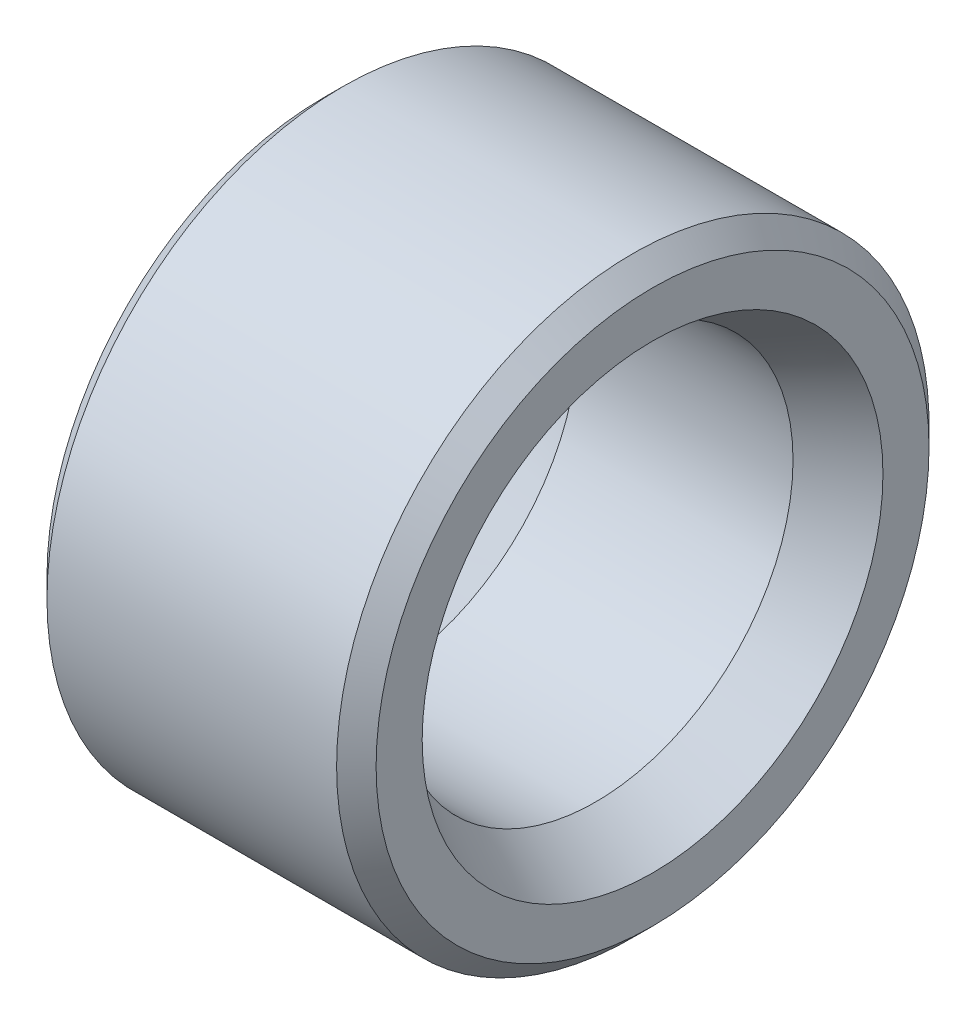
ISO-10303-21;
HEADER;
FILE_DESCRIPTION(('STEP AP214'),'2;1');
FILE_NAME('part.step','',(''),(''),'','','');
FILE_SCHEMA(('AUTOMOTIVE_DESIGN { 1 0 10303 214 1 1 1 1 }'));
ENDSEC;
DATA;
#1=APPLICATION_CONTEXT('core data for automotive mechanical design processes');
#2=APPLICATION_PROTOCOL_DEFINITION('international standard','automotive_design',2000,#1);
#3=PRODUCT_CONTEXT('',#1,'mechanical');
#4=PRODUCT('Part','Part','',(#3));
#5=PRODUCT_RELATED_PRODUCT_CATEGORY('part','',(#4));
#6=PRODUCT_DEFINITION_FORMATION('','',#4);
#7=PRODUCT_DEFINITION_CONTEXT('part definition',#1,'design');
#8=PRODUCT_DEFINITION('design','',#6,#7);
#9=PRODUCT_DEFINITION_SHAPE('','',#8);
#10=(LENGTH_UNIT() NAMED_UNIT(*) SI_UNIT(.MILLI.,.METRE.));
#11=(NAMED_UNIT(*) PLANE_ANGLE_UNIT() SI_UNIT($,.RADIAN.));
#12=(NAMED_UNIT(*) SI_UNIT($,.STERADIAN.) SOLID_ANGLE_UNIT());
#13=UNCERTAINTY_MEASURE_WITH_UNIT(LENGTH_MEASURE(1.E-05),#10,'distance_accuracy_value','');
#14=(GEOMETRIC_REPRESENTATION_CONTEXT(3) GLOBAL_UNCERTAINTY_ASSIGNED_CONTEXT((#13)) GLOBAL_UNIT_ASSIGNED_CONTEXT((#10,
#11,#12)) REPRESENTATION_CONTEXT('',''));
#15=CARTESIAN_POINT('',(0.,0.,0.));
#16=DIRECTION('',(0.,0.,1.));
#17=DIRECTION('',(1.,0.,0.));
#18=AXIS2_PLACEMENT_3D('',#15,#16,#17);
#19=CARTESIAN_POINT('',(0.,0.,0.));
#20=DIRECTION('',(-1.,0.,0.));
#21=DIRECTION('',(0.,0.,1.));
#22=AXIS2_PLACEMENT_3D('',#19,#20,#21);
#23=CYLINDRICAL_SURFACE('',#22,3.);
#24=CARTESIAN_POINT('',(0.866025403784451,0.,0.));
#25=DIRECTION('',(-1.,0.,0.));
#26=DIRECTION('',(0.,0.,1.));
#27=AXIS2_PLACEMENT_3D('',#24,#25,#26);
#28=CIRCLE('',#27,3.);
#29=CARTESIAN_POINT('',(0.866025403784451,0.,3.));
#30=VERTEX_POINT('',#29);
#31=EDGE_CURVE('E61',#30,#30,#28,.T.);
#32=ORIENTED_EDGE('',*,*,#31,.T.);
#33=EDGE_LOOP('',(#32));
#34=FACE_BOUND('',#33,.T.);
#35=CARTESIAN_POINT('',(4.13397459621555,0.,0.));
#36=DIRECTION('',(-1.,0.,0.));
#37=DIRECTION('',(0.,0.,1.));
#38=AXIS2_PLACEMENT_3D('',#35,#36,#37);
#39=CIRCLE('',#38,3.);
#40=CARTESIAN_POINT('',(4.13397459621555,0.,3.));
#41=VERTEX_POINT('',#40);
#42=EDGE_CURVE('E67',#41,#41,#39,.T.);
#43=ORIENTED_EDGE('',*,*,#42,.F.);
#44=EDGE_LOOP('',(#43));
#45=FACE_BOUND('',#44,.T.);
#46=ADVANCED_FACE('F38',(#34,#45),#23,.F.);
#47=CARTESIAN_POINT('',(5.,4.5,0.));
#48=DIRECTION('',(-1.,0.,0.));
#49=DIRECTION('',(0.,0.,1.));
#50=AXIS2_PLACEMENT_3D('',#47,#48,#49);
#51=PLANE('',#50);
#52=CARTESIAN_POINT('',(5.,0.,0.));
#53=DIRECTION('',(-1.,0.,0.));
#54=DIRECTION('',(0.,0.,1.));
#55=AXIS2_PLACEMENT_3D('',#52,#53,#54);
#56=CIRCLE('',#55,4.2);
#57=CARTESIAN_POINT('',(5.,0.,4.2));
#58=VERTEX_POINT('',#57);
#59=EDGE_CURVE('E45',#58,#58,#56,.F.);
#60=ORIENTED_EDGE('',*,*,#59,.T.);
#61=EDGE_LOOP('',(#60));
#62=FACE_BOUND('',#61,.T.);
#63=CARTESIAN_POINT('',(5.,0.,0.));
#64=DIRECTION('',(-1.,0.,0.));
#65=DIRECTION('',(0.,0.,1.));
#66=AXIS2_PLACEMENT_3D('',#63,#64,#65);
#67=CIRCLE('',#66,3.5);
#68=CARTESIAN_POINT('',(5.,0.,3.5));
#69=VERTEX_POINT('',#68);
#70=EDGE_CURVE('E64',#69,#69,#67,.T.);
#71=ORIENTED_EDGE('',*,*,#70,.T.);
#72=EDGE_LOOP('',(#71));
#73=FACE_BOUND('',#72,.T.);
#74=ADVANCED_FACE('F75',(#62,#73),#51,.F.);
#75=CARTESIAN_POINT('',(0.,3.,0.));
#76=DIRECTION('',(1.,0.,0.));
#77=DIRECTION('',(0.,0.,-1.));
#78=AXIS2_PLACEMENT_3D('',#75,#76,#77);
#79=PLANE('',#78);
#80=CARTESIAN_POINT('',(0.,0.,0.));
#81=DIRECTION('',(1.,0.,0.));
#82=DIRECTION('',(0.,0.,-1.));
#83=AXIS2_PLACEMENT_3D('',#80,#81,#82);
#84=CIRCLE('',#83,4.2);
#85=CARTESIAN_POINT('',(0.,0.,-4.2));
#86=VERTEX_POINT('',#85);
#87=EDGE_CURVE('E10',#86,#86,#84,.F.);
#88=ORIENTED_EDGE('',*,*,#87,.T.);
#89=EDGE_LOOP('',(#88));
#90=FACE_BOUND('',#89,.T.);
#91=CARTESIAN_POINT('',(0.,0.,0.));
#92=DIRECTION('',(-1.,0.,0.));
#93=DIRECTION('',(0.,0.,1.));
#94=AXIS2_PLACEMENT_3D('',#91,#92,#93);
#95=CIRCLE('',#94,3.5);
#96=CARTESIAN_POINT('',(0.,0.,3.5));
#97=VERTEX_POINT('',#96);
#98=EDGE_CURVE('E58',#97,#97,#95,.T.);
#99=ORIENTED_EDGE('',*,*,#98,.F.);
#100=EDGE_LOOP('',(#99));
#101=FACE_BOUND('',#100,.T.);
#102=ADVANCED_FACE('F81',(#90,#101),#79,.F.);
#103=CARTESIAN_POINT('',(0.,0.,0.));
#104=DIRECTION('',(-1.,0.,0.));
#105=DIRECTION('',(0.,0.,1.));
#106=AXIS2_PLACEMENT_3D('',#103,#104,#105);
#107=CYLINDRICAL_SURFACE('',#106,4.5);
#108=CARTESIAN_POINT('',(4.7,0.,0.));
#109=DIRECTION('',(-1.,0.,0.));
#110=DIRECTION('',(0.,0.,1.));
#111=AXIS2_PLACEMENT_3D('',#108,#109,#110);
#112=CIRCLE('',#111,4.5);
#113=CARTESIAN_POINT('',(4.7,0.,4.5));
#114=VERTEX_POINT('',#113);
#115=EDGE_CURVE('E49',#114,#114,#112,.T.);
#116=ORIENTED_EDGE('',*,*,#115,.T.);
#117=EDGE_LOOP('',(#116));
#118=FACE_BOUND('',#117,.T.);
#119=CARTESIAN_POINT('',(0.3,0.,0.));
#120=DIRECTION('',(1.,0.,0.));
#121=DIRECTION('',(0.,0.,-1.));
#122=AXIS2_PLACEMENT_3D('',#119,#120,#121);
#123=CIRCLE('',#122,4.5);
#124=CARTESIAN_POINT('',(0.3,0.,-4.5));
#125=VERTEX_POINT('',#124);
#126=EDGE_CURVE('E53',#125,#125,#123,.T.);
#127=ORIENTED_EDGE('',*,*,#126,.T.);
#128=EDGE_LOOP('',(#127));
#129=FACE_BOUND('',#128,.T.);
#130=ADVANCED_FACE('F87',(#118,#129),#107,.T.);
#131=CARTESIAN_POINT('',(4.7,0.,0.));
#132=DIRECTION('',(-1.,0.,0.));
#133=DIRECTION('',(0.,0.,1.));
#134=AXIS2_PLACEMENT_3D('',#131,#132,#133);
#135=CONICAL_SURFACE('',#134,4.5,0.785398163397446);
#136=ORIENTED_EDGE('',*,*,#59,.F.);
#137=EDGE_LOOP('',(#136));
#138=FACE_BOUND('',#137,.T.);
#139=ORIENTED_EDGE('',*,*,#115,.F.);
#140=EDGE_LOOP('',(#139));
#141=FACE_BOUND('',#140,.T.);
#142=ADVANCED_FACE('F85',(#138,#141),#135,.T.);
#143=CARTESIAN_POINT('',(0.,0.,0.));
#144=DIRECTION('',(1.,0.,0.));
#145=DIRECTION('',(0.,0.,-1.));
#146=AXIS2_PLACEMENT_3D('',#143,#144,#145);
#147=CONICAL_SURFACE('',#146,4.2,0.785398163397447);
#148=ORIENTED_EDGE('',*,*,#126,.F.);
#149=EDGE_LOOP('',(#148));
#150=FACE_BOUND('',#149,.T.);
#151=ORIENTED_EDGE('',*,*,#87,.F.);
#152=EDGE_LOOP('',(#151));
#153=FACE_BOUND('',#152,.T.);
#154=ADVANCED_FACE('F40',(#150,#153),#147,.T.);
#155=CARTESIAN_POINT('',(0.866025403784451,0.,0.));
#156=DIRECTION('',(-1.,0.,0.));
#157=DIRECTION('',(0.,0.,1.));
#158=AXIS2_PLACEMENT_3D('',#155,#156,#157);
#159=CONICAL_SURFACE('',#158,3.,0.523598775598293);
#160=ORIENTED_EDGE('',*,*,#98,.T.);
#161=EDGE_LOOP('',(#160));
#162=FACE_BOUND('',#161,.T.);
#163=ORIENTED_EDGE('',*,*,#31,.F.);
#164=EDGE_LOOP('',(#163));
#165=FACE_BOUND('',#164,.T.);
#166=ADVANCED_FACE('F93',(#162,#165),#159,.F.);
#167=CARTESIAN_POINT('',(5.,0.,0.));
#168=DIRECTION('',(1.,0.,0.));
#169=DIRECTION('',(0.,0.,-1.));
#170=AXIS2_PLACEMENT_3D('',#167,#168,#169);
#171=CONICAL_SURFACE('',#170,3.5,0.523598775598293);
#172=ORIENTED_EDGE('',*,*,#42,.T.);
#173=EDGE_LOOP('',(#172));
#174=FACE_BOUND('',#173,.T.);
#175=ORIENTED_EDGE('',*,*,#70,.F.);
#176=EDGE_LOOP('',(#175));
#177=FACE_BOUND('',#176,.T.);
#178=ADVANCED_FACE('F71',(#174,#177),#171,.F.);
#179=CLOSED_SHELL('',(#46,#74,#102,#130,#142,#154,#166,#178));
#180=MANIFOLD_SOLID_BREP('B2',#179);
#181=ADVANCED_BREP_SHAPE_REPRESENTATION('',(#18,#180),#14);
#182=SHAPE_DEFINITION_REPRESENTATION(#9,#181);
ENDSEC;
END-ISO-10303-21;
